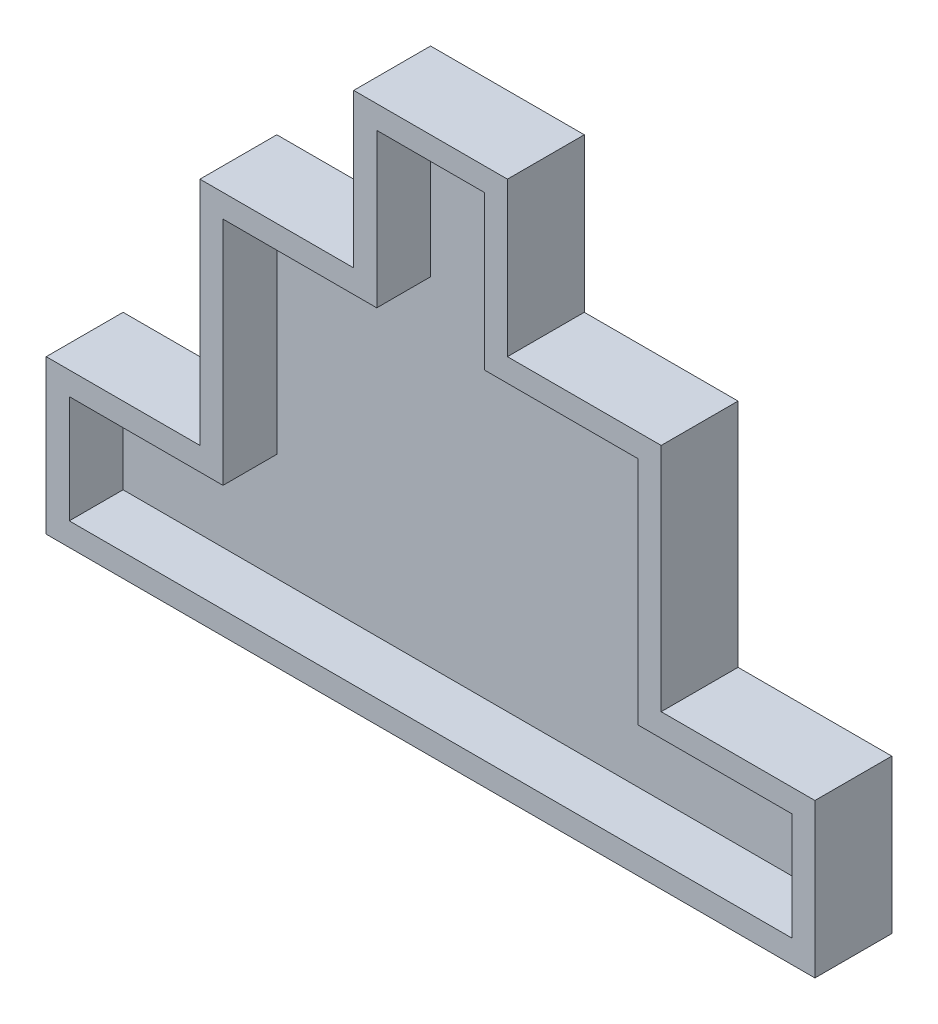
ISO-10303-21;
HEADER;
FILE_DESCRIPTION(('STEP AP214'),'2;1');
FILE_NAME('part.step','',(''),(''),'','','');
FILE_SCHEMA(('AUTOMOTIVE_DESIGN { 1 0 10303 214 1 1 1 1 }'));
ENDSEC;
DATA;
#1=APPLICATION_CONTEXT('core data for automotive mechanical design processes');
#2=APPLICATION_PROTOCOL_DEFINITION('international standard','automotive_design',2000,#1);
#3=PRODUCT_CONTEXT('',#1,'mechanical');
#4=PRODUCT('Part','Part','',(#3));
#5=PRODUCT_RELATED_PRODUCT_CATEGORY('part','',(#4));
#6=PRODUCT_DEFINITION_FORMATION('','',#4);
#7=PRODUCT_DEFINITION_CONTEXT('part definition',#1,'design');
#8=PRODUCT_DEFINITION('design','',#6,#7);
#9=PRODUCT_DEFINITION_SHAPE('','',#8);
#10=(LENGTH_UNIT() NAMED_UNIT(*) SI_UNIT(.MILLI.,.METRE.));
#11=(NAMED_UNIT(*) PLANE_ANGLE_UNIT() SI_UNIT($,.RADIAN.));
#12=(NAMED_UNIT(*) SI_UNIT($,.STERADIAN.) SOLID_ANGLE_UNIT());
#13=UNCERTAINTY_MEASURE_WITH_UNIT(LENGTH_MEASURE(1.E-05),#10,'distance_accuracy_value','');
#14=(GEOMETRIC_REPRESENTATION_CONTEXT(3) GLOBAL_UNCERTAINTY_ASSIGNED_CONTEXT((#13)) GLOBAL_UNIT_ASSIGNED_CONTEXT((#10,
#11,#12)) REPRESENTATION_CONTEXT('',''));
#15=CARTESIAN_POINT('',(0.,0.,0.));
#16=DIRECTION('',(0.,0.,1.));
#17=DIRECTION('',(1.,0.,0.));
#18=AXIS2_PLACEMENT_3D('',#15,#16,#17);
#19=CARTESIAN_POINT('',(75.,15.,4.5));
#20=DIRECTION('',(-1.,0.,0.));
#21=DIRECTION('',(0.,0.,1.));
#22=AXIS2_PLACEMENT_3D('',#19,#20,#21);
#23=PLANE('',#22);
#24=DIRECTION('',(0.,1.,0.));
#25=VECTOR('',#24,1.);
#26=CARTESIAN_POINT('',(75.,15.,0.));
#27=LINE('',#26,#25);
#28=CARTESIAN_POINT('',(75.,-15.,0.));
#29=VERTEX_POINT('',#28);
#30=CARTESIAN_POINT('',(75.,15.,0.));
#31=VERTEX_POINT('',#30);
#32=EDGE_CURVE('E378',#29,#31,#27,.T.);
#33=ORIENTED_EDGE('',*,*,#32,.T.);
#34=DIRECTION('',(0.,0.,-1.));
#35=VECTOR('',#34,1.);
#36=CARTESIAN_POINT('',(75.,15.,4.5));
#37=LINE('',#36,#35);
#38=CARTESIAN_POINT('',(75.,15.,15.));
#39=VERTEX_POINT('',#38);
#40=EDGE_CURVE('E11',#39,#31,#37,.T.);
#41=ORIENTED_EDGE('',*,*,#40,.F.);
#42=DIRECTION('',(0.,1.,0.));
#43=VECTOR('',#42,1.);
#44=CARTESIAN_POINT('',(75.,-15.,15.));
#45=LINE('',#44,#43);
#46=CARTESIAN_POINT('',(75.,-15.,15.));
#47=VERTEX_POINT('',#46);
#48=EDGE_CURVE('E362',#47,#39,#45,.T.);
#49=ORIENTED_EDGE('',*,*,#48,.F.);
#50=DIRECTION('',(0.,0.,-1.));
#51=VECTOR('',#50,1.);
#52=CARTESIAN_POINT('',(75.,-15.,4.5));
#53=LINE('',#52,#51);
#54=EDGE_CURVE('E415',#47,#29,#53,.T.);
#55=ORIENTED_EDGE('',*,*,#54,.T.);
#56=EDGE_LOOP('',(#33,#41,#49,#55));
#57=FACE_BOUND('',#56,.T.);
#58=ADVANCED_FACE('F41',(#57),#23,.F.);
#59=CARTESIAN_POINT('',(45.,15.,4.5));
#60=DIRECTION('',(0.,-1.,0.));
#61=DIRECTION('',(0.,0.,-1.));
#62=AXIS2_PLACEMENT_3D('',#59,#60,#61);
#63=PLANE('',#62);
#64=DIRECTION('',(-1.,0.,0.));
#65=VECTOR('',#64,1.);
#66=CARTESIAN_POINT('',(45.,15.,0.));
#67=LINE('',#66,#65);
#68=CARTESIAN_POINT('',(45.,15.,0.));
#69=VERTEX_POINT('',#68);
#70=EDGE_CURVE('E382',#31,#69,#67,.T.);
#71=ORIENTED_EDGE('',*,*,#70,.T.);
#72=DIRECTION('',(0.,0.,-1.));
#73=VECTOR('',#72,1.);
#74=CARTESIAN_POINT('',(45.,15.,4.5));
#75=LINE('',#74,#73);
#76=CARTESIAN_POINT('',(45.,15.,15.));
#77=VERTEX_POINT('',#76);
#78=EDGE_CURVE('E49',#77,#69,#75,.T.);
#79=ORIENTED_EDGE('',*,*,#78,.F.);
#80=DIRECTION('',(-1.,0.,0.));
#81=VECTOR('',#80,1.);
#82=CARTESIAN_POINT('',(75.,15.,15.));
#83=LINE('',#82,#81);
#84=EDGE_CURVE('E366',#39,#77,#83,.T.);
#85=ORIENTED_EDGE('',*,*,#84,.F.);
#86=ORIENTED_EDGE('',*,*,#40,.T.);
#87=EDGE_LOOP('',(#71,#79,#85,#86));
#88=FACE_BOUND('',#87,.T.);
#89=ADVANCED_FACE('F478',(#88),#63,.F.);
#90=CARTESIAN_POINT('',(45.,60.,4.5));
#91=DIRECTION('',(-1.,0.,0.));
#92=DIRECTION('',(0.,-1.,0.));
#93=AXIS2_PLACEMENT_3D('',#90,#91,#92);
#94=PLANE('',#93);
#95=DIRECTION('',(0.,1.,0.));
#96=VECTOR('',#95,1.);
#97=CARTESIAN_POINT('',(45.,60.,0.));
#98=LINE('',#97,#96);
#99=CARTESIAN_POINT('',(45.,60.,0.));
#100=VERTEX_POINT('',#99);
#101=EDGE_CURVE('E385',#69,#100,#98,.T.);
#102=ORIENTED_EDGE('',*,*,#101,.T.);
#103=DIRECTION('',(0.,0.,-1.));
#104=VECTOR('',#103,1.);
#105=CARTESIAN_POINT('',(45.,60.,4.5));
#106=LINE('',#105,#104);
#107=CARTESIAN_POINT('',(45.,60.,15.));
#108=VERTEX_POINT('',#107);
#109=EDGE_CURVE('E451',#108,#100,#106,.T.);
#110=ORIENTED_EDGE('',*,*,#109,.F.);
#111=DIRECTION('',(0.,1.,0.));
#112=VECTOR('',#111,1.);
#113=CARTESIAN_POINT('',(45.,15.,15.));
#114=LINE('',#113,#112);
#115=EDGE_CURVE('E370',#77,#108,#114,.T.);
#116=ORIENTED_EDGE('',*,*,#115,.F.);
#117=ORIENTED_EDGE('',*,*,#78,.T.);
#118=EDGE_LOOP('',(#102,#110,#116,#117));
#119=FACE_BOUND('',#118,.T.);
#120=ADVANCED_FACE('F459',(#119),#94,.F.);
#121=CARTESIAN_POINT('',(15.,60.,4.5));
#122=DIRECTION('',(0.,-1.,0.));
#123=DIRECTION('',(0.,0.,-1.));
#124=AXIS2_PLACEMENT_3D('',#121,#122,#123);
#125=PLANE('',#124);
#126=DIRECTION('',(-1.,0.,0.));
#127=VECTOR('',#126,1.);
#128=CARTESIAN_POINT('',(15.,60.,0.));
#129=LINE('',#128,#127);
#130=CARTESIAN_POINT('',(15.,60.,0.));
#131=VERTEX_POINT('',#130);
#132=EDGE_CURVE('E388',#100,#131,#129,.T.);
#133=ORIENTED_EDGE('',*,*,#132,.T.);
#134=DIRECTION('',(0.,0.,-1.));
#135=VECTOR('',#134,1.);
#136=CARTESIAN_POINT('',(15.,60.,4.5));
#137=LINE('',#136,#135);
#138=CARTESIAN_POINT('',(15.,60.,15.));
#139=VERTEX_POINT('',#138);
#140=EDGE_CURVE('E447',#139,#131,#137,.T.);
#141=ORIENTED_EDGE('',*,*,#140,.F.);
#142=DIRECTION('',(-1.,0.,0.));
#143=VECTOR('',#142,1.);
#144=CARTESIAN_POINT('',(45.,60.,15.));
#145=LINE('',#144,#143);
#146=EDGE_CURVE('E374',#108,#139,#145,.T.);
#147=ORIENTED_EDGE('',*,*,#146,.F.);
#148=ORIENTED_EDGE('',*,*,#109,.T.);
#149=EDGE_LOOP('',(#133,#141,#147,#148));
#150=FACE_BOUND('',#149,.T.);
#151=ADVANCED_FACE('F469',(#150),#125,.F.);
#152=CARTESIAN_POINT('',(15.,90.,4.5));
#153=DIRECTION('',(-1.,0.,0.));
#154=DIRECTION('',(0.,-1.,0.));
#155=AXIS2_PLACEMENT_3D('',#152,#153,#154);
#156=PLANE('',#155);
#157=DIRECTION('',(0.,1.,0.));
#158=VECTOR('',#157,1.);
#159=CARTESIAN_POINT('',(15.,90.,0.));
#160=LINE('',#159,#158);
#161=CARTESIAN_POINT('',(15.,90.,0.));
#162=VERTEX_POINT('',#161);
#163=EDGE_CURVE('E391',#131,#162,#160,.T.);
#164=ORIENTED_EDGE('',*,*,#163,.T.);
#165=DIRECTION('',(0.,0.,-1.));
#166=VECTOR('',#165,1.);
#167=CARTESIAN_POINT('',(15.,90.,4.5));
#168=LINE('',#167,#166);
#169=CARTESIAN_POINT('',(15.,90.,15.));
#170=VERTEX_POINT('',#169);
#171=EDGE_CURVE('E443',#170,#162,#168,.T.);
#172=ORIENTED_EDGE('',*,*,#171,.F.);
#173=DIRECTION('',(0.,1.,0.));
#174=VECTOR('',#173,1.);
#175=CARTESIAN_POINT('',(15.,60.,15.));
#176=LINE('',#175,#174);
#177=EDGE_CURVE('E218',#139,#170,#176,.T.);
#178=ORIENTED_EDGE('',*,*,#177,.F.);
#179=ORIENTED_EDGE('',*,*,#140,.T.);
#180=EDGE_LOOP('',(#164,#172,#178,#179));
#181=FACE_BOUND('',#180,.T.);
#182=ADVANCED_FACE('F473',(#181),#156,.F.);
#183=CARTESIAN_POINT('',(-15.,90.,4.5));
#184=DIRECTION('',(0.,-1.,0.));
#185=DIRECTION('',(0.,0.,-1.));
#186=AXIS2_PLACEMENT_3D('',#183,#184,#185);
#187=PLANE('',#186);
#188=DIRECTION('',(-1.,0.,0.));
#189=VECTOR('',#188,1.);
#190=CARTESIAN_POINT('',(-15.,90.,0.));
#191=LINE('',#190,#189);
#192=CARTESIAN_POINT('',(-15.,90.,0.));
#193=VERTEX_POINT('',#192);
#194=EDGE_CURVE('E394',#162,#193,#191,.T.);
#195=ORIENTED_EDGE('',*,*,#194,.T.);
#196=DIRECTION('',(0.,0.,-1.));
#197=VECTOR('',#196,1.);
#198=CARTESIAN_POINT('',(-15.,90.,4.5));
#199=LINE('',#198,#197);
#200=CARTESIAN_POINT('',(-15.,90.,15.));
#201=VERTEX_POINT('',#200);
#202=EDGE_CURVE('E439',#201,#193,#199,.T.);
#203=ORIENTED_EDGE('',*,*,#202,.F.);
#204=DIRECTION('',(-1.,0.,0.));
#205=VECTOR('',#204,1.);
#206=CARTESIAN_POINT('',(15.,90.,15.));
#207=LINE('',#206,#205);
#208=EDGE_CURVE('E334',#170,#201,#207,.T.);
#209=ORIENTED_EDGE('',*,*,#208,.F.);
#210=ORIENTED_EDGE('',*,*,#171,.T.);
#211=EDGE_LOOP('',(#195,#203,#209,#210));
#212=FACE_BOUND('',#211,.T.);
#213=ADVANCED_FACE('F504',(#212),#187,.F.);
#214=CARTESIAN_POINT('',(-15.,90.,4.5));
#215=DIRECTION('',(1.,0.,0.));
#216=DIRECTION('',(0.,1.,0.));
#217=AXIS2_PLACEMENT_3D('',#214,#215,#216);
#218=PLANE('',#217);
#219=DIRECTION('',(0.,-1.,0.));
#220=VECTOR('',#219,1.);
#221=CARTESIAN_POINT('',(-15.,90.,0.));
#222=LINE('',#221,#220);
#223=CARTESIAN_POINT('',(-15.,60.,0.));
#224=VERTEX_POINT('',#223);
#225=EDGE_CURVE('E397',#193,#224,#222,.T.);
#226=ORIENTED_EDGE('',*,*,#225,.T.);
#227=DIRECTION('',(0.,0.,-1.));
#228=VECTOR('',#227,1.);
#229=CARTESIAN_POINT('',(-15.,60.,4.5));
#230=LINE('',#229,#228);
#231=CARTESIAN_POINT('',(-15.,60.,15.));
#232=VERTEX_POINT('',#231);
#233=EDGE_CURVE('E435',#232,#224,#230,.T.);
#234=ORIENTED_EDGE('',*,*,#233,.F.);
#235=DIRECTION('',(0.,-1.,0.));
#236=VECTOR('',#235,1.);
#237=CARTESIAN_POINT('',(-15.,90.,15.));
#238=LINE('',#237,#236);
#239=EDGE_CURVE('E338',#201,#232,#238,.T.);
#240=ORIENTED_EDGE('',*,*,#239,.F.);
#241=ORIENTED_EDGE('',*,*,#202,.T.);
#242=EDGE_LOOP('',(#226,#234,#240,#241));
#243=FACE_BOUND('',#242,.T.);
#244=ADVANCED_FACE('F502',(#243),#218,.F.);
#245=CARTESIAN_POINT('',(-45.,60.,4.5));
#246=DIRECTION('',(0.,-1.,0.));
#247=DIRECTION('',(0.,0.,-1.));
#248=AXIS2_PLACEMENT_3D('',#245,#246,#247);
#249=PLANE('',#248);
#250=DIRECTION('',(-1.,0.,0.));
#251=VECTOR('',#250,1.);
#252=CARTESIAN_POINT('',(-45.,60.,0.));
#253=LINE('',#252,#251);
#254=CARTESIAN_POINT('',(-45.,60.,0.));
#255=VERTEX_POINT('',#254);
#256=EDGE_CURVE('E400',#224,#255,#253,.T.);
#257=ORIENTED_EDGE('',*,*,#256,.T.);
#258=DIRECTION('',(0.,0.,-1.));
#259=VECTOR('',#258,1.);
#260=CARTESIAN_POINT('',(-45.,60.,4.5));
#261=LINE('',#260,#259);
#262=CARTESIAN_POINT('',(-45.,60.,15.));
#263=VERTEX_POINT('',#262);
#264=EDGE_CURVE('E431',#263,#255,#261,.T.);
#265=ORIENTED_EDGE('',*,*,#264,.F.);
#266=DIRECTION('',(-1.,0.,0.));
#267=VECTOR('',#266,1.);
#268=CARTESIAN_POINT('',(-15.,60.,15.));
#269=LINE('',#268,#267);
#270=EDGE_CURVE('E342',#232,#263,#269,.T.);
#271=ORIENTED_EDGE('',*,*,#270,.F.);
#272=ORIENTED_EDGE('',*,*,#233,.T.);
#273=EDGE_LOOP('',(#257,#265,#271,#272));
#274=FACE_BOUND('',#273,.T.);
#275=ADVANCED_FACE('F500',(#274),#249,.F.);
#276=CARTESIAN_POINT('',(-45.,60.,4.5));
#277=DIRECTION('',(1.,0.,0.));
#278=DIRECTION('',(0.,1.,0.));
#279=AXIS2_PLACEMENT_3D('',#276,#277,#278);
#280=PLANE('',#279);
#281=DIRECTION('',(0.,-1.,0.));
#282=VECTOR('',#281,1.);
#283=CARTESIAN_POINT('',(-45.,60.,0.));
#284=LINE('',#283,#282);
#285=CARTESIAN_POINT('',(-45.,15.,0.));
#286=VERTEX_POINT('',#285);
#287=EDGE_CURVE('E403',#255,#286,#284,.T.);
#288=ORIENTED_EDGE('',*,*,#287,.T.);
#289=DIRECTION('',(0.,0.,-1.));
#290=VECTOR('',#289,1.);
#291=CARTESIAN_POINT('',(-45.,15.,4.5));
#292=LINE('',#291,#290);
#293=CARTESIAN_POINT('',(-45.,15.,15.));
#294=VERTEX_POINT('',#293);
#295=EDGE_CURVE('E427',#294,#286,#292,.T.);
#296=ORIENTED_EDGE('',*,*,#295,.F.);
#297=DIRECTION('',(0.,-1.,0.));
#298=VECTOR('',#297,1.);
#299=CARTESIAN_POINT('',(-45.,60.,15.));
#300=LINE('',#299,#298);
#301=EDGE_CURVE('E346',#263,#294,#300,.T.);
#302=ORIENTED_EDGE('',*,*,#301,.F.);
#303=ORIENTED_EDGE('',*,*,#264,.T.);
#304=EDGE_LOOP('',(#288,#296,#302,#303));
#305=FACE_BOUND('',#304,.T.);
#306=ADVANCED_FACE('F497',(#305),#280,.F.);
#307=CARTESIAN_POINT('',(-75.,15.,4.5));
#308=DIRECTION('',(0.,-1.,0.));
#309=DIRECTION('',(0.,0.,-1.));
#310=AXIS2_PLACEMENT_3D('',#307,#308,#309);
#311=PLANE('',#310);
#312=DIRECTION('',(-1.,0.,0.));
#313=VECTOR('',#312,1.);
#314=CARTESIAN_POINT('',(-75.,15.,0.));
#315=LINE('',#314,#313);
#316=CARTESIAN_POINT('',(-75.,15.,0.));
#317=VERTEX_POINT('',#316);
#318=EDGE_CURVE('E406',#286,#317,#315,.T.);
#319=ORIENTED_EDGE('',*,*,#318,.T.);
#320=DIRECTION('',(0.,0.,-1.));
#321=VECTOR('',#320,1.);
#322=CARTESIAN_POINT('',(-75.,15.,4.5));
#323=LINE('',#322,#321);
#324=CARTESIAN_POINT('',(-75.,15.,15.));
#325=VERTEX_POINT('',#324);
#326=EDGE_CURVE('E423',#325,#317,#323,.T.);
#327=ORIENTED_EDGE('',*,*,#326,.F.);
#328=DIRECTION('',(-1.,0.,0.));
#329=VECTOR('',#328,1.);
#330=CARTESIAN_POINT('',(-45.,15.,15.));
#331=LINE('',#330,#329);
#332=EDGE_CURVE('E350',#294,#325,#331,.T.);
#333=ORIENTED_EDGE('',*,*,#332,.F.);
#334=ORIENTED_EDGE('',*,*,#295,.T.);
#335=EDGE_LOOP('',(#319,#327,#333,#334));
#336=FACE_BOUND('',#335,.T.);
#337=ADVANCED_FACE('F492',(#336),#311,.F.);
#338=CARTESIAN_POINT('',(-75.,15.,4.5));
#339=DIRECTION('',(1.,0.,0.));
#340=DIRECTION('',(0.,0.,-1.));
#341=AXIS2_PLACEMENT_3D('',#338,#339,#340);
#342=PLANE('',#341);
#343=DIRECTION('',(0.,-1.,0.));
#344=VECTOR('',#343,1.);
#345=CARTESIAN_POINT('',(-75.,15.,0.));
#346=LINE('',#345,#344);
#347=CARTESIAN_POINT('',(-75.,-15.,0.));
#348=VERTEX_POINT('',#347);
#349=EDGE_CURVE('E409',#317,#348,#346,.T.);
#350=ORIENTED_EDGE('',*,*,#349,.T.);
#351=DIRECTION('',(0.,0.,-1.));
#352=VECTOR('',#351,1.);
#353=CARTESIAN_POINT('',(-75.,-15.,4.5));
#354=LINE('',#353,#352);
#355=CARTESIAN_POINT('',(-75.,-15.,15.));
#356=VERTEX_POINT('',#355);
#357=EDGE_CURVE('E419',#356,#348,#354,.T.);
#358=ORIENTED_EDGE('',*,*,#357,.F.);
#359=DIRECTION('',(0.,-1.,0.));
#360=VECTOR('',#359,1.);
#361=CARTESIAN_POINT('',(-75.,15.,15.));
#362=LINE('',#361,#360);
#363=EDGE_CURVE('E354',#325,#356,#362,.T.);
#364=ORIENTED_EDGE('',*,*,#363,.F.);
#365=ORIENTED_EDGE('',*,*,#326,.T.);
#366=EDGE_LOOP('',(#350,#358,#364,#365));
#367=FACE_BOUND('',#366,.T.);
#368=ADVANCED_FACE('F488',(#367),#342,.F.);
#369=CARTESIAN_POINT('',(-75.,-15.,4.5));
#370=DIRECTION('',(0.,1.,0.));
#371=DIRECTION('',(0.,0.,1.));
#372=AXIS2_PLACEMENT_3D('',#369,#370,#371);
#373=PLANE('',#372);
#374=DIRECTION('',(1.,0.,0.));
#375=VECTOR('',#374,1.);
#376=CARTESIAN_POINT('',(-75.,-15.,0.));
#377=LINE('',#376,#375);
#378=EDGE_CURVE('E412',#348,#29,#377,.T.);
#379=ORIENTED_EDGE('',*,*,#378,.T.);
#380=ORIENTED_EDGE('',*,*,#54,.F.);
#381=DIRECTION('',(1.,0.,0.));
#382=VECTOR('',#381,1.);
#383=CARTESIAN_POINT('',(-75.,-15.,15.));
#384=LINE('',#383,#382);
#385=EDGE_CURVE('E358',#356,#47,#384,.T.);
#386=ORIENTED_EDGE('',*,*,#385,.F.);
#387=ORIENTED_EDGE('',*,*,#357,.T.);
#388=EDGE_LOOP('',(#379,#380,#386,#387));
#389=FACE_BOUND('',#388,.T.);
#390=ADVANCED_FACE('F484',(#389),#373,.F.);
#391=CARTESIAN_POINT('',(0.,0.,0.));
#392=DIRECTION('',(0.,0.,1.));
#393=DIRECTION('',(1.,0.,0.));
#394=AXIS2_PLACEMENT_3D('',#391,#392,#393);
#395=PLANE('',#394);
#396=ORIENTED_EDGE('',*,*,#32,.F.);
#397=ORIENTED_EDGE('',*,*,#378,.F.);
#398=ORIENTED_EDGE('',*,*,#349,.F.);
#399=ORIENTED_EDGE('',*,*,#318,.F.);
#400=ORIENTED_EDGE('',*,*,#287,.F.);
#401=ORIENTED_EDGE('',*,*,#256,.F.);
#402=ORIENTED_EDGE('',*,*,#225,.F.);
#403=ORIENTED_EDGE('',*,*,#194,.F.);
#404=ORIENTED_EDGE('',*,*,#163,.F.);
#405=ORIENTED_EDGE('',*,*,#132,.F.);
#406=ORIENTED_EDGE('',*,*,#101,.F.);
#407=ORIENTED_EDGE('',*,*,#70,.F.);
#408=EDGE_LOOP('',(#396,#397,#398,#399,#400,#401,#402,#403,#404,#405,#406,#407));
#409=FACE_BOUND('',#408,.T.);
#410=ADVANCED_FACE('F465',(#409),#395,.F.);
#411=CARTESIAN_POINT('',(0.,0.,15.));
#412=DIRECTION('',(0.,0.,1.));
#413=DIRECTION('',(1.,0.,0.));
#414=AXIS2_PLACEMENT_3D('',#411,#412,#413);
#415=PLANE('',#414);
#416=ORIENTED_EDGE('',*,*,#177,.T.);
#417=ORIENTED_EDGE('',*,*,#208,.T.);
#418=ORIENTED_EDGE('',*,*,#239,.T.);
#419=ORIENTED_EDGE('',*,*,#270,.T.);
#420=ORIENTED_EDGE('',*,*,#301,.T.);
#421=ORIENTED_EDGE('',*,*,#332,.T.);
#422=ORIENTED_EDGE('',*,*,#363,.T.);
#423=ORIENTED_EDGE('',*,*,#385,.T.);
#424=ORIENTED_EDGE('',*,*,#48,.T.);
#425=ORIENTED_EDGE('',*,*,#84,.T.);
#426=ORIENTED_EDGE('',*,*,#115,.T.);
#427=ORIENTED_EDGE('',*,*,#146,.T.);
#428=EDGE_LOOP('',(#416,#417,#418,#419,#420,#421,#422,#423,#424,#425,#426,#427));
#429=FACE_BOUND('',#428,.T.);
#430=DIRECTION('',(0.,1.,0.));
#431=VECTOR('',#430,1.);
#432=CARTESIAN_POINT('',(10.5,55.5,15.));
#433=LINE('',#432,#431);
#434=CARTESIAN_POINT('',(10.5,55.5,15.));
#435=VERTEX_POINT('',#434);
#436=CARTESIAN_POINT('',(10.5,85.5,15.));
#437=VERTEX_POINT('',#436);
#438=EDGE_CURVE('E211',#435,#437,#433,.T.);
#439=ORIENTED_EDGE('',*,*,#438,.F.);
#440=DIRECTION('',(-1.,0.,0.));
#441=VECTOR('',#440,1.);
#442=CARTESIAN_POINT('',(40.5,55.5,15.));
#443=LINE('',#442,#441);
#444=CARTESIAN_POINT('',(40.5,55.5,15.));
#445=VERTEX_POINT('',#444);
#446=EDGE_CURVE('E201',#445,#435,#443,.T.);
#447=ORIENTED_EDGE('',*,*,#446,.F.);
#448=DIRECTION('',(0.,1.,0.));
#449=VECTOR('',#448,1.);
#450=CARTESIAN_POINT('',(40.5,10.5,15.));
#451=LINE('',#450,#449);
#452=CARTESIAN_POINT('',(40.5,10.5,15.));
#453=VERTEX_POINT('',#452);
#454=EDGE_CURVE('E255',#453,#445,#451,.T.);
#455=ORIENTED_EDGE('',*,*,#454,.F.);
#456=DIRECTION('',(-1.,0.,0.));
#457=VECTOR('',#456,1.);
#458=CARTESIAN_POINT('',(70.5,10.5,15.));
#459=LINE('',#458,#457);
#460=CARTESIAN_POINT('',(70.5,10.5,15.));
#461=VERTEX_POINT('',#460);
#462=EDGE_CURVE('E251',#461,#453,#459,.T.);
#463=ORIENTED_EDGE('',*,*,#462,.F.);
#464=DIRECTION('',(0.,1.,0.));
#465=VECTOR('',#464,1.);
#466=CARTESIAN_POINT('',(70.5,-10.5,15.));
#467=LINE('',#466,#465);
#468=CARTESIAN_POINT('',(70.5,-10.5,15.));
#469=VERTEX_POINT('',#468);
#470=EDGE_CURVE('E248',#469,#461,#467,.T.);
#471=ORIENTED_EDGE('',*,*,#470,.F.);
#472=DIRECTION('',(1.,0.,0.));
#473=VECTOR('',#472,1.);
#474=CARTESIAN_POINT('',(-70.5,-10.5,15.));
#475=LINE('',#474,#473);
#476=CARTESIAN_POINT('',(-70.5,-10.5,15.));
#477=VERTEX_POINT('',#476);
#478=EDGE_CURVE('E245',#477,#469,#475,.T.);
#479=ORIENTED_EDGE('',*,*,#478,.F.);
#480=DIRECTION('',(0.,-1.,0.));
#481=VECTOR('',#480,1.);
#482=CARTESIAN_POINT('',(-70.5,10.5,15.));
#483=LINE('',#482,#481);
#484=CARTESIAN_POINT('',(-70.5,10.5,15.));
#485=VERTEX_POINT('',#484);
#486=EDGE_CURVE('E242',#485,#477,#483,.T.);
#487=ORIENTED_EDGE('',*,*,#486,.F.);
#488=DIRECTION('',(-1.,0.,0.));
#489=VECTOR('',#488,1.);
#490=CARTESIAN_POINT('',(-40.5,10.5,15.));
#491=LINE('',#490,#489);
#492=CARTESIAN_POINT('',(-40.5,10.5,15.));
#493=VERTEX_POINT('',#492);
#494=EDGE_CURVE('E239',#493,#485,#491,.T.);
#495=ORIENTED_EDGE('',*,*,#494,.F.);
#496=DIRECTION('',(0.,-1.,0.));
#497=VECTOR('',#496,1.);
#498=CARTESIAN_POINT('',(-40.5,55.5,15.));
#499=LINE('',#498,#497);
#500=CARTESIAN_POINT('',(-40.5,55.5,15.));
#501=VERTEX_POINT('',#500);
#502=EDGE_CURVE('E236',#501,#493,#499,.T.);
#503=ORIENTED_EDGE('',*,*,#502,.F.);
#504=DIRECTION('',(-1.,0.,0.));
#505=VECTOR('',#504,1.);
#506=CARTESIAN_POINT('',(-10.5,55.5,15.));
#507=LINE('',#506,#505);
#508=CARTESIAN_POINT('',(-10.5,55.5,15.));
#509=VERTEX_POINT('',#508);
#510=EDGE_CURVE('E233',#509,#501,#507,.T.);
#511=ORIENTED_EDGE('',*,*,#510,.F.);
#512=DIRECTION('',(0.,-1.,0.));
#513=VECTOR('',#512,1.);
#514=CARTESIAN_POINT('',(-10.5,85.5,15.));
#515=LINE('',#514,#513);
#516=CARTESIAN_POINT('',(-10.5,85.5,15.));
#517=VERTEX_POINT('',#516);
#518=EDGE_CURVE('E228',#517,#509,#515,.T.);
#519=ORIENTED_EDGE('',*,*,#518,.F.);
#520=DIRECTION('',(-1.,0.,0.));
#521=VECTOR('',#520,1.);
#522=CARTESIAN_POINT('',(10.5,85.5,15.));
#523=LINE('',#522,#521);
#524=EDGE_CURVE('E224',#437,#517,#523,.T.);
#525=ORIENTED_EDGE('',*,*,#524,.F.);
#526=EDGE_LOOP('',(#439,#447,#455,#463,#471,#479,#487,#495,#503,#511,#519,#525));
#527=FACE_BOUND('',#526,.T.);
#528=ADVANCED_FACE('F222',(#429,#527),#415,.T.);
#529=CARTESIAN_POINT('',(40.5,55.5,15.));
#530=DIRECTION('',(0.,-1.,0.));
#531=DIRECTION('',(0.,0.,-1.));
#532=AXIS2_PLACEMENT_3D('',#529,#530,#531);
#533=PLANE('',#532);
#534=DIRECTION('',(-1.,0.,0.));
#535=VECTOR('',#534,1.);
#536=CARTESIAN_POINT('',(40.5,55.5,4.5));
#537=LINE('',#536,#535);
#538=CARTESIAN_POINT('',(40.5,55.5,4.5));
#539=VERTEX_POINT('',#538);
#540=CARTESIAN_POINT('',(10.5,55.5,4.5));
#541=VERTEX_POINT('',#540);
#542=EDGE_CURVE('E56',#539,#541,#537,.T.);
#543=ORIENTED_EDGE('',*,*,#542,.F.);
#544=DIRECTION('',(0.,0.,-1.));
#545=VECTOR('',#544,1.);
#546=CARTESIAN_POINT('',(40.5,55.5,15.));
#547=LINE('',#546,#545);
#548=EDGE_CURVE('E206',#445,#539,#547,.T.);
#549=ORIENTED_EDGE('',*,*,#548,.F.);
#550=ORIENTED_EDGE('',*,*,#446,.T.);
#551=DIRECTION('',(0.,0.,-1.));
#552=VECTOR('',#551,1.);
#553=CARTESIAN_POINT('',(10.5,55.5,15.));
#554=LINE('',#553,#552);
#555=EDGE_CURVE('E204',#435,#541,#554,.T.);
#556=ORIENTED_EDGE('',*,*,#555,.T.);
#557=EDGE_LOOP('',(#543,#549,#550,#556));
#558=FACE_BOUND('',#557,.T.);
#559=ADVANCED_FACE('F203',(#558),#533,.T.);
#560=CARTESIAN_POINT('',(10.5,55.5,15.));
#561=DIRECTION('',(-1.,0.,0.));
#562=DIRECTION('',(0.,-1.,0.));
#563=AXIS2_PLACEMENT_3D('',#560,#561,#562);
#564=PLANE('',#563);
#565=DIRECTION('',(0.,1.,0.));
#566=VECTOR('',#565,1.);
#567=CARTESIAN_POINT('',(10.5,55.5,4.5));
#568=LINE('',#567,#566);
#569=CARTESIAN_POINT('',(10.5,85.5,4.5));
#570=VERTEX_POINT('',#569);
#571=EDGE_CURVE('E60',#541,#570,#568,.T.);
#572=ORIENTED_EDGE('',*,*,#571,.F.);
#573=ORIENTED_EDGE('',*,*,#555,.F.);
#574=ORIENTED_EDGE('',*,*,#438,.T.);
#575=DIRECTION('',(0.,0.,-1.));
#576=VECTOR('',#575,1.);
#577=CARTESIAN_POINT('',(10.5,85.5,15.));
#578=LINE('',#577,#576);
#579=EDGE_CURVE('E219',#437,#570,#578,.T.);
#580=ORIENTED_EDGE('',*,*,#579,.T.);
#581=EDGE_LOOP('',(#572,#573,#574,#580));
#582=FACE_BOUND('',#581,.T.);
#583=ADVANCED_FACE('F215',(#582),#564,.T.);
#584=CARTESIAN_POINT('',(10.5,85.5,15.));
#585=DIRECTION('',(0.,-1.,0.));
#586=DIRECTION('',(0.,0.,-1.));
#587=AXIS2_PLACEMENT_3D('',#584,#585,#586);
#588=PLANE('',#587);
#589=DIRECTION('',(-1.,0.,0.));
#590=VECTOR('',#589,1.);
#591=CARTESIAN_POINT('',(10.5,85.5,4.5));
#592=LINE('',#591,#590);
#593=CARTESIAN_POINT('',(-10.5,85.5,4.5));
#594=VERTEX_POINT('',#593);
#595=EDGE_CURVE('E262',#570,#594,#592,.T.);
#596=ORIENTED_EDGE('',*,*,#595,.F.);
#597=ORIENTED_EDGE('',*,*,#579,.F.);
#598=ORIENTED_EDGE('',*,*,#524,.T.);
#599=DIRECTION('',(0.,0.,-1.));
#600=VECTOR('',#599,1.);
#601=CARTESIAN_POINT('',(-10.5,85.5,15.));
#602=LINE('',#601,#600);
#603=EDGE_CURVE('E325',#517,#594,#602,.T.);
#604=ORIENTED_EDGE('',*,*,#603,.T.);
#605=EDGE_LOOP('',(#596,#597,#598,#604));
#606=FACE_BOUND('',#605,.T.);
#607=ADVANCED_FACE('F589',(#606),#588,.T.);
#608=CARTESIAN_POINT('',(-10.5,85.5,15.));
#609=DIRECTION('',(1.,0.,0.));
#610=DIRECTION('',(0.,1.,0.));
#611=AXIS2_PLACEMENT_3D('',#608,#609,#610);
#612=PLANE('',#611);
#613=DIRECTION('',(0.,-1.,0.));
#614=VECTOR('',#613,1.);
#615=CARTESIAN_POINT('',(-10.5,85.5,4.5));
#616=LINE('',#615,#614);
#617=CARTESIAN_POINT('',(-10.5,55.5,4.5));
#618=VERTEX_POINT('',#617);
#619=EDGE_CURVE('E265',#594,#618,#616,.T.);
#620=ORIENTED_EDGE('',*,*,#619,.F.);
#621=ORIENTED_EDGE('',*,*,#603,.F.);
#622=ORIENTED_EDGE('',*,*,#518,.T.);
#623=DIRECTION('',(0.,0.,-1.));
#624=VECTOR('',#623,1.);
#625=CARTESIAN_POINT('',(-10.5,55.5,15.));
#626=LINE('',#625,#624);
#627=EDGE_CURVE('E321',#509,#618,#626,.T.);
#628=ORIENTED_EDGE('',*,*,#627,.T.);
#629=EDGE_LOOP('',(#620,#621,#622,#628));
#630=FACE_BOUND('',#629,.T.);
#631=ADVANCED_FACE('F585',(#630),#612,.T.);
#632=CARTESIAN_POINT('',(-10.5,55.5,15.));
#633=DIRECTION('',(0.,-1.,0.));
#634=DIRECTION('',(0.,0.,-1.));
#635=AXIS2_PLACEMENT_3D('',#632,#633,#634);
#636=PLANE('',#635);
#637=DIRECTION('',(-1.,0.,0.));
#638=VECTOR('',#637,1.);
#639=CARTESIAN_POINT('',(-10.5,55.5,4.5));
#640=LINE('',#639,#638);
#641=CARTESIAN_POINT('',(-40.5,55.5,4.5));
#642=VERTEX_POINT('',#641);
#643=EDGE_CURVE('E268',#618,#642,#640,.T.);
#644=ORIENTED_EDGE('',*,*,#643,.F.);
#645=ORIENTED_EDGE('',*,*,#627,.F.);
#646=ORIENTED_EDGE('',*,*,#510,.T.);
#647=DIRECTION('',(0.,0.,-1.));
#648=VECTOR('',#647,1.);
#649=CARTESIAN_POINT('',(-40.5,55.5,15.));
#650=LINE('',#649,#648);
#651=EDGE_CURVE('E317',#501,#642,#650,.T.);
#652=ORIENTED_EDGE('',*,*,#651,.T.);
#653=EDGE_LOOP('',(#644,#645,#646,#652));
#654=FACE_BOUND('',#653,.T.);
#655=ADVANCED_FACE('F577',(#654),#636,.T.);
#656=CARTESIAN_POINT('',(-40.5,55.5,15.));
#657=DIRECTION('',(1.,0.,0.));
#658=DIRECTION('',(0.,1.,0.));
#659=AXIS2_PLACEMENT_3D('',#656,#657,#658);
#660=PLANE('',#659);
#661=DIRECTION('',(0.,-1.,0.));
#662=VECTOR('',#661,1.);
#663=CARTESIAN_POINT('',(-40.5,55.5,4.5));
#664=LINE('',#663,#662);
#665=CARTESIAN_POINT('',(-40.5,10.5,4.5));
#666=VERTEX_POINT('',#665);
#667=EDGE_CURVE('E271',#642,#666,#664,.T.);
#668=ORIENTED_EDGE('',*,*,#667,.F.);
#669=ORIENTED_EDGE('',*,*,#651,.F.);
#670=ORIENTED_EDGE('',*,*,#502,.T.);
#671=DIRECTION('',(0.,0.,-1.));
#672=VECTOR('',#671,1.);
#673=CARTESIAN_POINT('',(-40.5,10.5,15.));
#674=LINE('',#673,#672);
#675=EDGE_CURVE('E313',#493,#666,#674,.T.);
#676=ORIENTED_EDGE('',*,*,#675,.T.);
#677=EDGE_LOOP('',(#668,#669,#670,#676));
#678=FACE_BOUND('',#677,.T.);
#679=ADVANCED_FACE('F572',(#678),#660,.T.);
#680=CARTESIAN_POINT('',(-40.5,10.5,15.));
#681=DIRECTION('',(0.,-1.,0.));
#682=DIRECTION('',(0.,0.,-1.));
#683=AXIS2_PLACEMENT_3D('',#680,#681,#682);
#684=PLANE('',#683);
#685=DIRECTION('',(-1.,0.,0.));
#686=VECTOR('',#685,1.);
#687=CARTESIAN_POINT('',(-40.5,10.5,4.5));
#688=LINE('',#687,#686);
#689=CARTESIAN_POINT('',(-70.5,10.5,4.5));
#690=VERTEX_POINT('',#689);
#691=EDGE_CURVE('E274',#666,#690,#688,.T.);
#692=ORIENTED_EDGE('',*,*,#691,.F.);
#693=ORIENTED_EDGE('',*,*,#675,.F.);
#694=ORIENTED_EDGE('',*,*,#494,.T.);
#695=DIRECTION('',(0.,0.,-1.));
#696=VECTOR('',#695,1.);
#697=CARTESIAN_POINT('',(-70.5,10.5,15.));
#698=LINE('',#697,#696);
#699=EDGE_CURVE('E309',#485,#690,#698,.T.);
#700=ORIENTED_EDGE('',*,*,#699,.T.);
#701=EDGE_LOOP('',(#692,#693,#694,#700));
#702=FACE_BOUND('',#701,.T.);
#703=ADVANCED_FACE('F562',(#702),#684,.T.);
#704=CARTESIAN_POINT('',(-70.5,10.5,15.));
#705=DIRECTION('',(1.,0.,0.));
#706=DIRECTION('',(0.,0.,-1.));
#707=AXIS2_PLACEMENT_3D('',#704,#705,#706);
#708=PLANE('',#707);
#709=DIRECTION('',(0.,-1.,0.));
#710=VECTOR('',#709,1.);
#711=CARTESIAN_POINT('',(-70.5,10.5,4.5));
#712=LINE('',#711,#710);
#713=CARTESIAN_POINT('',(-70.5,-10.5,4.5));
#714=VERTEX_POINT('',#713);
#715=EDGE_CURVE('E277',#690,#714,#712,.T.);
#716=ORIENTED_EDGE('',*,*,#715,.F.);
#717=ORIENTED_EDGE('',*,*,#699,.F.);
#718=ORIENTED_EDGE('',*,*,#486,.T.);
#719=DIRECTION('',(0.,0.,-1.));
#720=VECTOR('',#719,1.);
#721=CARTESIAN_POINT('',(-70.5,-10.5,15.));
#722=LINE('',#721,#720);
#723=EDGE_CURVE('E305',#477,#714,#722,.T.);
#724=ORIENTED_EDGE('',*,*,#723,.T.);
#725=EDGE_LOOP('',(#716,#717,#718,#724));
#726=FACE_BOUND('',#725,.T.);
#727=ADVANCED_FACE('F556',(#726),#708,.T.);
#728=CARTESIAN_POINT('',(-70.5,-10.5,15.));
#729=DIRECTION('',(0.,1.,0.));
#730=DIRECTION('',(0.,0.,1.));
#731=AXIS2_PLACEMENT_3D('',#728,#729,#730);
#732=PLANE('',#731);
#733=DIRECTION('',(1.,0.,0.));
#734=VECTOR('',#733,1.);
#735=CARTESIAN_POINT('',(-70.5,-10.5,4.5));
#736=LINE('',#735,#734);
#737=CARTESIAN_POINT('',(70.5,-10.5,4.5));
#738=VERTEX_POINT('',#737);
#739=EDGE_CURVE('E280',#714,#738,#736,.T.);
#740=ORIENTED_EDGE('',*,*,#739,.F.);
#741=ORIENTED_EDGE('',*,*,#723,.F.);
#742=ORIENTED_EDGE('',*,*,#478,.T.);
#743=DIRECTION('',(0.,0.,-1.));
#744=VECTOR('',#743,1.);
#745=CARTESIAN_POINT('',(70.5,-10.5,15.));
#746=LINE('',#745,#744);
#747=EDGE_CURVE('E301',#469,#738,#746,.T.);
#748=ORIENTED_EDGE('',*,*,#747,.T.);
#749=EDGE_LOOP('',(#740,#741,#742,#748));
#750=FACE_BOUND('',#749,.T.);
#751=ADVANCED_FACE('F561',(#750),#732,.T.);
#752=CARTESIAN_POINT('',(70.5,-10.5,15.));
#753=DIRECTION('',(-1.,0.,0.));
#754=DIRECTION('',(0.,0.,1.));
#755=AXIS2_PLACEMENT_3D('',#752,#753,#754);
#756=PLANE('',#755);
#757=DIRECTION('',(0.,1.,0.));
#758=VECTOR('',#757,1.);
#759=CARTESIAN_POINT('',(70.5,-10.5,4.5));
#760=LINE('',#759,#758);
#761=CARTESIAN_POINT('',(70.5,10.5,4.5));
#762=VERTEX_POINT('',#761);
#763=EDGE_CURVE('E283',#738,#762,#760,.T.);
#764=ORIENTED_EDGE('',*,*,#763,.F.);
#765=ORIENTED_EDGE('',*,*,#747,.F.);
#766=ORIENTED_EDGE('',*,*,#470,.T.);
#767=DIRECTION('',(0.,0.,-1.));
#768=VECTOR('',#767,1.);
#769=CARTESIAN_POINT('',(70.5,10.5,15.));
#770=LINE('',#769,#768);
#771=EDGE_CURVE('E297',#461,#762,#770,.T.);
#772=ORIENTED_EDGE('',*,*,#771,.T.);
#773=EDGE_LOOP('',(#764,#765,#766,#772));
#774=FACE_BOUND('',#773,.T.);
#775=ADVANCED_FACE('F623',(#774),#756,.T.);
#776=CARTESIAN_POINT('',(70.5,10.5,15.));
#777=DIRECTION('',(0.,-1.,0.));
#778=DIRECTION('',(0.,0.,-1.));
#779=AXIS2_PLACEMENT_3D('',#776,#777,#778);
#780=PLANE('',#779);
#781=DIRECTION('',(-1.,0.,0.));
#782=VECTOR('',#781,1.);
#783=CARTESIAN_POINT('',(70.5,10.5,4.5));
#784=LINE('',#783,#782);
#785=CARTESIAN_POINT('',(40.5,10.5,4.5));
#786=VERTEX_POINT('',#785);
#787=EDGE_CURVE('E286',#762,#786,#784,.T.);
#788=ORIENTED_EDGE('',*,*,#787,.F.);
#789=ORIENTED_EDGE('',*,*,#771,.F.);
#790=ORIENTED_EDGE('',*,*,#462,.T.);
#791=DIRECTION('',(0.,0.,-1.));
#792=VECTOR('',#791,1.);
#793=CARTESIAN_POINT('',(40.5,10.5,15.));
#794=LINE('',#793,#792);
#795=EDGE_CURVE('E293',#453,#786,#794,.T.);
#796=ORIENTED_EDGE('',*,*,#795,.T.);
#797=EDGE_LOOP('',(#788,#789,#790,#796));
#798=FACE_BOUND('',#797,.T.);
#799=ADVANCED_FACE('F632',(#798),#780,.T.);
#800=CARTESIAN_POINT('',(40.5,10.5,15.));
#801=DIRECTION('',(-1.,0.,0.));
#802=DIRECTION('',(0.,-1.,0.));
#803=AXIS2_PLACEMENT_3D('',#800,#801,#802);
#804=PLANE('',#803);
#805=DIRECTION('',(0.,1.,0.));
#806=VECTOR('',#805,1.);
#807=CARTESIAN_POINT('',(40.5,10.5,4.5));
#808=LINE('',#807,#806);
#809=EDGE_CURVE('E212',#786,#539,#808,.T.);
#810=ORIENTED_EDGE('',*,*,#809,.F.);
#811=ORIENTED_EDGE('',*,*,#795,.F.);
#812=ORIENTED_EDGE('',*,*,#454,.T.);
#813=ORIENTED_EDGE('',*,*,#548,.T.);
#814=EDGE_LOOP('',(#810,#811,#812,#813));
#815=FACE_BOUND('',#814,.T.);
#816=ADVANCED_FACE('F641',(#815),#804,.T.);
#817=CARTESIAN_POINT('',(0.,0.,4.5));
#818=DIRECTION('',(0.,0.,1.));
#819=DIRECTION('',(1.,0.,0.));
#820=AXIS2_PLACEMENT_3D('',#817,#818,#819);
#821=PLANE('',#820);
#822=ORIENTED_EDGE('',*,*,#542,.T.);
#823=ORIENTED_EDGE('',*,*,#571,.T.);
#824=ORIENTED_EDGE('',*,*,#595,.T.);
#825=ORIENTED_EDGE('',*,*,#619,.T.);
#826=ORIENTED_EDGE('',*,*,#643,.T.);
#827=ORIENTED_EDGE('',*,*,#667,.T.);
#828=ORIENTED_EDGE('',*,*,#691,.T.);
#829=ORIENTED_EDGE('',*,*,#715,.T.);
#830=ORIENTED_EDGE('',*,*,#739,.T.);
#831=ORIENTED_EDGE('',*,*,#763,.T.);
#832=ORIENTED_EDGE('',*,*,#787,.T.);
#833=ORIENTED_EDGE('',*,*,#809,.T.);
#834=EDGE_LOOP('',(#822,#823,#824,#825,#826,#827,#828,#829,#830,#831,#832,#833));
#835=FACE_BOUND('',#834,.T.);
#836=ADVANCED_FACE('F649',(#835),#821,.T.);
#837=CLOSED_SHELL('',(#58,#89,#120,#151,#182,#213,#244,#275,#306,#337,#368,#390,#410,#528,#559,
#583,#607,#631,#655,#679,#703,#727,#751,#775,#799,#816,#836));
#838=MANIFOLD_SOLID_BREP('B2',#837);
#839=ADVANCED_BREP_SHAPE_REPRESENTATION('',(#18,#838),#14);
#840=SHAPE_DEFINITION_REPRESENTATION(#9,#839);
ENDSEC;
END-ISO-10303-21;
